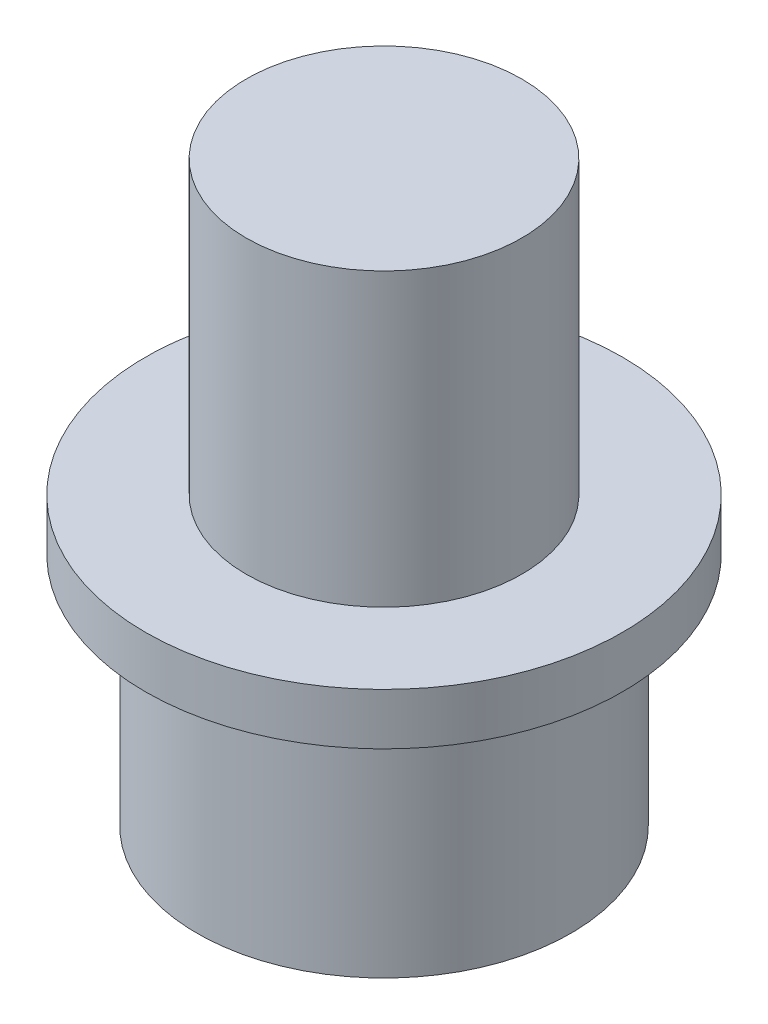
ISO-10303-21;
HEADER;
FILE_DESCRIPTION(('STEP AP214'),'2;1');
FILE_NAME('part.step','',(''),(''),'','','');
FILE_SCHEMA(('AUTOMOTIVE_DESIGN { 1 0 10303 214 1 1 1 1 }'));
ENDSEC;
DATA;
#1=APPLICATION_CONTEXT('core data for automotive mechanical design processes');
#2=APPLICATION_PROTOCOL_DEFINITION('international standard','automotive_design',2000,#1);
#3=PRODUCT_CONTEXT('',#1,'mechanical');
#4=PRODUCT('Part','Part','',(#3));
#5=PRODUCT_RELATED_PRODUCT_CATEGORY('part','',(#4));
#6=PRODUCT_DEFINITION_FORMATION('','',#4);
#7=PRODUCT_DEFINITION_CONTEXT('part definition',#1,'design');
#8=PRODUCT_DEFINITION('design','',#6,#7);
#9=PRODUCT_DEFINITION_SHAPE('','',#8);
#10=(LENGTH_UNIT() NAMED_UNIT(*) SI_UNIT(.MILLI.,.METRE.));
#11=(NAMED_UNIT(*) PLANE_ANGLE_UNIT() SI_UNIT($,.RADIAN.));
#12=(NAMED_UNIT(*) SI_UNIT($,.STERADIAN.) SOLID_ANGLE_UNIT());
#13=UNCERTAINTY_MEASURE_WITH_UNIT(LENGTH_MEASURE(1.E-05),#10,'distance_accuracy_value','');
#14=(GEOMETRIC_REPRESENTATION_CONTEXT(3) GLOBAL_UNCERTAINTY_ASSIGNED_CONTEXT((#13)) GLOBAL_UNIT_ASSIGNED_CONTEXT((#10,
#11,#12)) REPRESENTATION_CONTEXT('',''));
#15=CARTESIAN_POINT('',(0.,0.,0.));
#16=DIRECTION('',(0.,0.,1.));
#17=DIRECTION('',(1.,0.,0.));
#18=AXIS2_PLACEMENT_3D('',#15,#16,#17);
#19=CARTESIAN_POINT('',(0.,0.,0.));
#20=DIRECTION('',(0.,-1.,0.));
#21=DIRECTION('',(0.,0.,-1.));
#22=AXIS2_PLACEMENT_3D('',#19,#20,#21);
#23=CYLINDRICAL_SURFACE('',#22,3.98);
#24=CARTESIAN_POINT('',(0.,3.92,0.));
#25=DIRECTION('',(0.,-1.,0.));
#26=DIRECTION('',(0.,0.,-1.));
#27=AXIS2_PLACEMENT_3D('',#24,#25,#26);
#28=CIRCLE('',#27,3.98);
#29=CARTESIAN_POINT('',(0.,3.92,-3.98));
#30=VERTEX_POINT('',#29);
#31=EDGE_CURVE('E43',#30,#30,#28,.T.);
#32=ORIENTED_EDGE('',*,*,#31,.F.);
#33=EDGE_LOOP('',(#32));
#34=FACE_BOUND('',#33,.T.);
#35=CARTESIAN_POINT('',(0.,4.78,0.));
#36=DIRECTION('',(0.,1.,0.));
#37=DIRECTION('',(0.,0.,1.));
#38=AXIS2_PLACEMENT_3D('',#35,#36,#37);
#39=CIRCLE('',#38,3.98);
#40=CARTESIAN_POINT('',(0.,4.78,3.98));
#41=VERTEX_POINT('',#40);
#42=EDGE_CURVE('E65',#41,#41,#39,.T.);
#43=ORIENTED_EDGE('',*,*,#42,.F.);
#44=EDGE_LOOP('',(#43));
#45=FACE_BOUND('',#44,.T.);
#46=ADVANCED_FACE('F36',(#34,#45),#23,.T.);
#47=CARTESIAN_POINT('',(3.12,0.,0.));
#48=DIRECTION('',(0.,-1.,0.));
#49=DIRECTION('',(0.,0.,-1.));
#50=AXIS2_PLACEMENT_3D('',#47,#48,#49);
#51=PLANE('',#50);
#52=CARTESIAN_POINT('',(0.,0.,0.));
#53=DIRECTION('',(0.,-1.,0.));
#54=DIRECTION('',(0.,0.,-1.));
#55=AXIS2_PLACEMENT_3D('',#52,#53,#54);
#56=CIRCLE('',#55,2.3);
#57=CARTESIAN_POINT('',(0.,0.,-2.3));
#58=VERTEX_POINT('',#57);
#59=EDGE_CURVE('E57',#58,#58,#56,.T.);
#60=ORIENTED_EDGE('',*,*,#59,.F.);
#61=EDGE_LOOP('',(#60));
#62=FACE_BOUND('',#61,.T.);
#63=CARTESIAN_POINT('',(0.,0.,0.));
#64=DIRECTION('',(0.,-1.,0.));
#65=DIRECTION('',(0.,0.,-1.));
#66=AXIS2_PLACEMENT_3D('',#63,#64,#65);
#67=CIRCLE('',#66,3.12);
#68=CARTESIAN_POINT('',(0.,0.,-3.12));
#69=VERTEX_POINT('',#68);
#70=EDGE_CURVE('E51',#69,#69,#67,.T.);
#71=ORIENTED_EDGE('',*,*,#70,.T.);
#72=EDGE_LOOP('',(#71));
#73=FACE_BOUND('',#72,.T.);
#74=ADVANCED_FACE('F38',(#62,#73),#51,.T.);
#75=CARTESIAN_POINT('',(3.98,3.92,0.));
#76=DIRECTION('',(0.,-1.,0.));
#77=DIRECTION('',(0.,0.,-1.));
#78=AXIS2_PLACEMENT_3D('',#75,#76,#77);
#79=PLANE('',#78);
#80=ORIENTED_EDGE('',*,*,#31,.T.);
#81=EDGE_LOOP('',(#80));
#82=FACE_BOUND('',#81,.T.);
#83=CARTESIAN_POINT('',(0.,3.92,0.));
#84=DIRECTION('',(0.,-1.,0.));
#85=DIRECTION('',(0.,0.,-1.));
#86=AXIS2_PLACEMENT_3D('',#83,#84,#85);
#87=CIRCLE('',#86,3.12);
#88=CARTESIAN_POINT('',(0.,3.92,-3.12));
#89=VERTEX_POINT('',#88);
#90=EDGE_CURVE('E47',#89,#89,#87,.T.);
#91=ORIENTED_EDGE('',*,*,#90,.F.);
#92=EDGE_LOOP('',(#91));
#93=FACE_BOUND('',#92,.T.);
#94=ADVANCED_FACE('F80',(#82,#93),#79,.T.);
#95=CARTESIAN_POINT('',(0.,0.,0.));
#96=DIRECTION('',(0.,-1.,0.));
#97=DIRECTION('',(0.,0.,-1.));
#98=AXIS2_PLACEMENT_3D('',#95,#96,#97);
#99=CYLINDRICAL_SURFACE('',#98,3.12);
#100=ORIENTED_EDGE('',*,*,#90,.T.);
#101=EDGE_LOOP('',(#100));
#102=FACE_BOUND('',#101,.T.);
#103=ORIENTED_EDGE('',*,*,#70,.F.);
#104=EDGE_LOOP('',(#103));
#105=FACE_BOUND('',#104,.T.);
#106=ADVANCED_FACE('F104',(#102,#105),#99,.T.);
#107=CARTESIAN_POINT('',(0.,3.92,0.));
#108=DIRECTION('',(0.,-1.,0.));
#109=DIRECTION('',(0.,0.,-1.));
#110=AXIS2_PLACEMENT_3D('',#107,#108,#109);
#111=CYLINDRICAL_SURFACE('',#110,2.3);
#112=CARTESIAN_POINT('',(0.,3.92,0.));
#113=DIRECTION('',(0.,-1.,0.));
#114=DIRECTION('',(0.,0.,-1.));
#115=AXIS2_PLACEMENT_3D('',#112,#113,#114);
#116=CIRCLE('',#115,2.3);
#117=CARTESIAN_POINT('',(0.,3.92,-2.3));
#118=VERTEX_POINT('',#117);
#119=EDGE_CURVE('E56',#118,#118,#116,.T.);
#120=ORIENTED_EDGE('',*,*,#119,.F.);
#121=EDGE_LOOP('',(#120));
#122=FACE_BOUND('',#121,.T.);
#123=ORIENTED_EDGE('',*,*,#59,.T.);
#124=EDGE_LOOP('',(#123));
#125=FACE_BOUND('',#124,.T.);
#126=ADVANCED_FACE('F99',(#122,#125),#111,.F.);
#127=CARTESIAN_POINT('',(0.,3.92,0.));
#128=DIRECTION('',(0.,-1.,0.));
#129=DIRECTION('',(0.,0.,-1.));
#130=AXIS2_PLACEMENT_3D('',#127,#128,#129);
#131=PLANE('',#130);
#132=ORIENTED_EDGE('',*,*,#119,.T.);
#133=EDGE_LOOP('',(#132));
#134=FACE_BOUND('',#133,.T.);
#135=ADVANCED_FACE('F94',(#134),#131,.T.);
#136=CARTESIAN_POINT('',(0.,4.78,0.));
#137=DIRECTION('',(0.,1.,0.));
#138=DIRECTION('',(0.,0.,1.));
#139=AXIS2_PLACEMENT_3D('',#136,#137,#138);
#140=PLANE('',#139);
#141=ORIENTED_EDGE('',*,*,#42,.T.);
#142=EDGE_LOOP('',(#141));
#143=FACE_BOUND('',#142,.T.);
#144=CARTESIAN_POINT('',(0.,4.78,0.));
#145=DIRECTION('',(0.,1.,0.));
#146=DIRECTION('',(0.,0.,1.));
#147=AXIS2_PLACEMENT_3D('',#144,#145,#146);
#148=CIRCLE('',#147,2.3);
#149=CARTESIAN_POINT('',(0.,4.78,2.3));
#150=VERTEX_POINT('',#149);
#151=EDGE_CURVE('E60',#150,#150,#148,.F.);
#152=ORIENTED_EDGE('',*,*,#151,.T.);
#153=EDGE_LOOP('',(#152));
#154=FACE_BOUND('',#153,.T.);
#155=ADVANCED_FACE('F69',(#143,#154),#140,.T.);
#156=CARTESIAN_POINT('',(0.,9.64,0.));
#157=DIRECTION('',(0.,1.,0.));
#158=DIRECTION('',(0.,0.,1.));
#159=AXIS2_PLACEMENT_3D('',#156,#157,#158);
#160=PLANE('',#159);
#161=CARTESIAN_POINT('',(0.,9.64,0.));
#162=DIRECTION('',(0.,-1.,0.));
#163=DIRECTION('',(0.,0.,-1.));
#164=AXIS2_PLACEMENT_3D('',#161,#162,#163);
#165=CIRCLE('',#164,2.3);
#166=CARTESIAN_POINT('',(0.,9.64,-2.3));
#167=VERTEX_POINT('',#166);
#168=EDGE_CURVE('E10',#167,#167,#165,.T.);
#169=ORIENTED_EDGE('',*,*,#168,.F.);
#170=EDGE_LOOP('',(#169));
#171=FACE_BOUND('',#170,.T.);
#172=ADVANCED_FACE('F87',(#171),#160,.T.);
#173=CARTESIAN_POINT('',(0.,0.,0.));
#174=DIRECTION('',(0.,-1.,0.));
#175=DIRECTION('',(0.,0.,-1.));
#176=AXIS2_PLACEMENT_3D('',#173,#174,#175);
#177=CYLINDRICAL_SURFACE('',#176,2.3);
#178=ORIENTED_EDGE('',*,*,#168,.T.);
#179=EDGE_LOOP('',(#178));
#180=FACE_BOUND('',#179,.T.);
#181=ORIENTED_EDGE('',*,*,#151,.F.);
#182=EDGE_LOOP('',(#181));
#183=FACE_BOUND('',#182,.T.);
#184=ADVANCED_FACE('F85',(#180,#183),#177,.T.);
#185=CLOSED_SHELL('',(#46,#74,#94,#106,#126,#135,#155,#172,#184));
#186=MANIFOLD_SOLID_BREP('B2',#185);
#187=ADVANCED_BREP_SHAPE_REPRESENTATION('',(#18,#186),#14);
#188=SHAPE_DEFINITION_REPRESENTATION(#9,#187);
ENDSEC;
END-ISO-10303-21;
